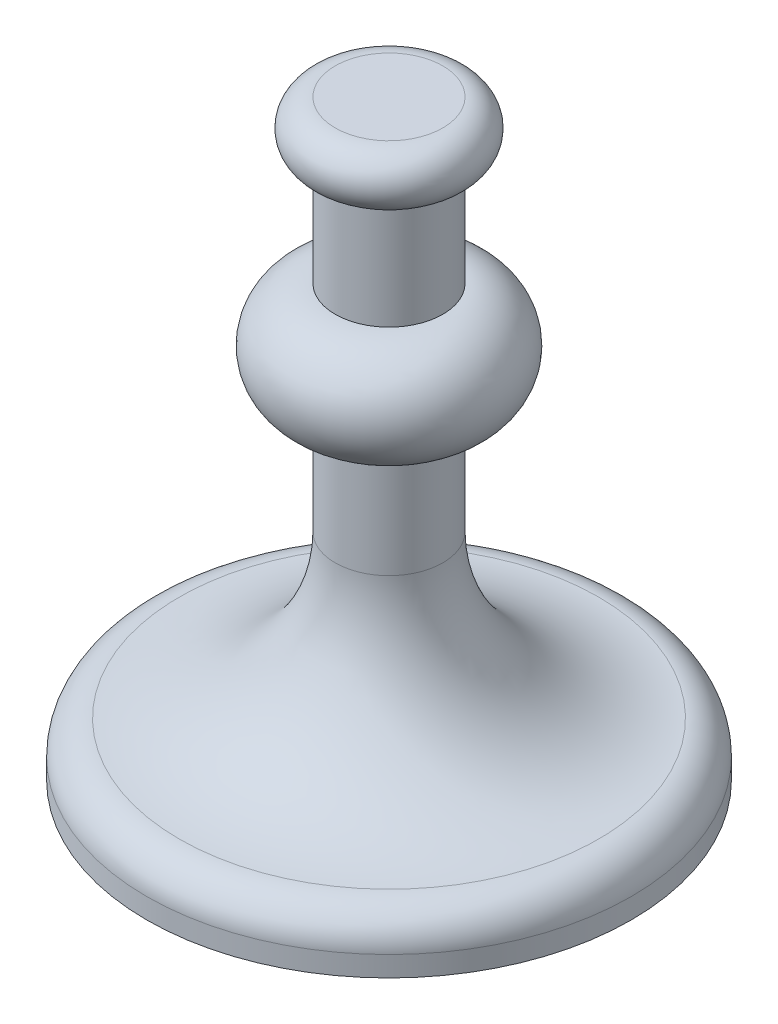
ISO-10303-21;
HEADER;
FILE_DESCRIPTION(('STEP AP214'),'2;1');
FILE_NAME('part.step','',(''),(''),'','','');
FILE_SCHEMA(('AUTOMOTIVE_DESIGN { 1 0 10303 214 1 1 1 1 }'));
ENDSEC;
DATA;
#1=APPLICATION_CONTEXT('core data for automotive mechanical design processes');
#2=APPLICATION_PROTOCOL_DEFINITION('international standard','automotive_design',2000,#1);
#3=PRODUCT_CONTEXT('',#1,'mechanical');
#4=PRODUCT('Part','Part','',(#3));
#5=PRODUCT_RELATED_PRODUCT_CATEGORY('part','',(#4));
#6=PRODUCT_DEFINITION_FORMATION('','',#4);
#7=PRODUCT_DEFINITION_CONTEXT('part definition',#1,'design');
#8=PRODUCT_DEFINITION('design','',#6,#7);
#9=PRODUCT_DEFINITION_SHAPE('','',#8);
#10=(LENGTH_UNIT() NAMED_UNIT(*) SI_UNIT(.MILLI.,.METRE.));
#11=(NAMED_UNIT(*) PLANE_ANGLE_UNIT() SI_UNIT($,.RADIAN.));
#12=(NAMED_UNIT(*) SI_UNIT($,.STERADIAN.) SOLID_ANGLE_UNIT());
#13=UNCERTAINTY_MEASURE_WITH_UNIT(LENGTH_MEASURE(1.E-05),#10,'distance_accuracy_value','');
#14=(GEOMETRIC_REPRESENTATION_CONTEXT(3) GLOBAL_UNCERTAINTY_ASSIGNED_CONTEXT((#13)) GLOBAL_UNIT_ASSIGNED_CONTEXT((#10,
#11,#12)) REPRESENTATION_CONTEXT('',''));
#15=CARTESIAN_POINT('',(0.,0.,0.));
#16=DIRECTION('',(0.,0.,1.));
#17=DIRECTION('',(1.,0.,0.));
#18=AXIS2_PLACEMENT_3D('',#15,#16,#17);
#19=CARTESIAN_POINT('',(0.,100.,0.));
#20=DIRECTION('',(0.,1.,0.));
#21=DIRECTION('',(0.,0.,1.));
#22=AXIS2_PLACEMENT_3D('',#19,#20,#21);
#23=TOROIDAL_SURFACE('',#22,20.,9.99999999999999);
#24=CARTESIAN_POINT('',(0.,110.,0.));
#25=DIRECTION('',(0.,1.,0.));
#26=DIRECTION('',(0.,0.,1.));
#27=AXIS2_PLACEMENT_3D('',#24,#25,#26);
#28=CIRCLE('',#27,20.);
#29=CARTESIAN_POINT('',(0.,110.,20.));
#30=VERTEX_POINT('',#29);
#31=EDGE_CURVE('E78',#30,#30,#28,.T.);
#32=ORIENTED_EDGE('',*,*,#31,.F.);
#33=EDGE_LOOP('',(#32));
#34=FACE_BOUND('',#33,.T.);
#35=CARTESIAN_POINT('',(0.,90.,0.));
#36=DIRECTION('',(0.,1.,0.));
#37=DIRECTION('',(0.,0.,1.));
#38=AXIS2_PLACEMENT_3D('',#35,#36,#37);
#39=CIRCLE('',#38,20.);
#40=CARTESIAN_POINT('',(0.,90.,20.));
#41=VERTEX_POINT('',#40);
#42=EDGE_CURVE('E10',#41,#41,#39,.T.);
#43=ORIENTED_EDGE('',*,*,#42,.T.);
#44=EDGE_LOOP('',(#43));
#45=FACE_BOUND('',#44,.T.);
#46=ADVANCED_FACE('F43',(#34,#45),#23,.T.);
#47=CARTESIAN_POINT('',(0.,110.,0.));
#48=DIRECTION('',(0.,1.,0.));
#49=DIRECTION('',(0.,0.,1.));
#50=AXIS2_PLACEMENT_3D('',#47,#48,#49);
#51=CYLINDRICAL_SURFACE('',#50,20.);
#52=ORIENTED_EDGE('',*,*,#42,.F.);
#53=EDGE_LOOP('',(#52));
#54=FACE_BOUND('',#53,.T.);
#55=CARTESIAN_POINT('',(0.,50.,0.));
#56=DIRECTION('',(0.,1.,0.));
#57=DIRECTION('',(0.,0.,1.));
#58=AXIS2_PLACEMENT_3D('',#55,#56,#57);
#59=CIRCLE('',#58,20.);
#60=CARTESIAN_POINT('',(0.,50.,20.));
#61=VERTEX_POINT('',#60);
#62=EDGE_CURVE('E50',#61,#61,#59,.T.);
#63=ORIENTED_EDGE('',*,*,#62,.T.);
#64=EDGE_LOOP('',(#63));
#65=FACE_BOUND('',#64,.T.);
#66=ADVANCED_FACE('F86',(#54,#65),#51,.T.);
#67=CARTESIAN_POINT('',(0.,30.0008100600805,0.));
#68=DIRECTION('',(0.,1.,0.));
#69=DIRECTION('',(0.,0.,1.));
#70=AXIS2_PLACEMENT_3D('',#67,#68,#69);
#71=TOROIDAL_SURFACE('',#70,20.1800048527752,20.);
#72=ORIENTED_EDGE('',*,*,#62,.F.);
#73=EDGE_LOOP('',(#72));
#74=FACE_BOUND('',#73,.T.);
#75=CARTESIAN_POINT('',(0.,10.001620120161,0.));
#76=DIRECTION('',(0.,1.,0.));
#77=DIRECTION('',(0.,0.,1.));
#78=AXIS2_PLACEMENT_3D('',#75,#76,#77);
#79=CIRCLE('',#78,20.);
#80=CARTESIAN_POINT('',(0.,10.001620120161,20.));
#81=VERTEX_POINT('',#80);
#82=EDGE_CURVE('E55',#81,#81,#79,.T.);
#83=ORIENTED_EDGE('',*,*,#82,.T.);
#84=EDGE_LOOP('',(#83));
#85=FACE_BOUND('',#84,.T.);
#86=ADVANCED_FACE('F90',(#74,#85),#71,.T.);
#87=CARTESIAN_POINT('',(0.,110.,0.));
#88=DIRECTION('',(0.,1.,0.));
#89=DIRECTION('',(0.,0.,1.));
#90=AXIS2_PLACEMENT_3D('',#87,#88,#89);
#91=CYLINDRICAL_SURFACE('',#90,20.);
#92=ORIENTED_EDGE('',*,*,#82,.F.);
#93=EDGE_LOOP('',(#92));
#94=FACE_BOUND('',#93,.T.);
#95=CARTESIAN_POINT('',(0.,-30.,0.));
#96=DIRECTION('',(0.,1.,0.));
#97=DIRECTION('',(0.,0.,1.));
#98=AXIS2_PLACEMENT_3D('',#95,#96,#97);
#99=CIRCLE('',#98,20.);
#100=CARTESIAN_POINT('',(0.,-30.,20.));
#101=VERTEX_POINT('',#100);
#102=EDGE_CURVE('E60',#101,#101,#99,.T.);
#103=ORIENTED_EDGE('',*,*,#102,.T.);
#104=EDGE_LOOP('',(#103));
#105=FACE_BOUND('',#104,.T.);
#106=ADVANCED_FACE('F95',(#94,#105),#91,.T.);
#107=CARTESIAN_POINT('',(0.,-30.,0.));
#108=DIRECTION('',(0.,1.,0.));
#109=DIRECTION('',(0.,0.,1.));
#110=AXIS2_PLACEMENT_3D('',#107,#108,#109);
#111=TOROIDAL_SURFACE('',#110,80.,60.);
#112=ORIENTED_EDGE('',*,*,#102,.F.);
#113=EDGE_LOOP('',(#112));
#114=FACE_BOUND('',#113,.T.);
#115=CARTESIAN_POINT('',(0.,-89.964317570439,0.));
#116=DIRECTION('',(0.,1.,0.));
#117=DIRECTION('',(0.,0.,1.));
#118=AXIS2_PLACEMENT_3D('',#115,#116,#117);
#119=CIRCLE('',#118,77.9310344827586);
#120=CARTESIAN_POINT('',(0.,-89.964317570439,77.9310344827586));
#121=VERTEX_POINT('',#120);
#122=EDGE_CURVE('E66',#121,#121,#119,.T.);
#123=ORIENTED_EDGE('',*,*,#122,.T.);
#124=EDGE_LOOP('',(#123));
#125=FACE_BOUND('',#124,.T.);
#126=ADVANCED_FACE('F101',(#114,#125),#111,.F.);
#127=CARTESIAN_POINT('',(0.,-102.456883730947,0.));
#128=DIRECTION('',(0.,1.,0.));
#129=DIRECTION('',(0.,0.,1.));
#130=AXIS2_PLACEMENT_3D('',#127,#128,#129);
#131=TOROIDAL_SURFACE('',#130,77.5,12.5);
#132=ORIENTED_EDGE('',*,*,#122,.F.);
#133=EDGE_LOOP('',(#132));
#134=FACE_BOUND('',#133,.T.);
#135=CARTESIAN_POINT('',(0.,-102.456883730947,0.));
#136=DIRECTION('',(0.,1.,0.));
#137=DIRECTION('',(0.,0.,1.));
#138=AXIS2_PLACEMENT_3D('',#135,#136,#137);
#139=CIRCLE('',#138,90.);
#140=CARTESIAN_POINT('',(0.,-102.456883730947,90.));
#141=VERTEX_POINT('',#140);
#142=EDGE_CURVE('E70',#141,#141,#139,.T.);
#143=ORIENTED_EDGE('',*,*,#142,.T.);
#144=EDGE_LOOP('',(#143));
#145=FACE_BOUND('',#144,.T.);
#146=ADVANCED_FACE('F105',(#134,#145),#131,.T.);
#147=CARTESIAN_POINT('',(0.,110.,0.));
#148=DIRECTION('',(0.,1.,0.));
#149=DIRECTION('',(0.,0.,1.));
#150=AXIS2_PLACEMENT_3D('',#147,#148,#149);
#151=CYLINDRICAL_SURFACE('',#150,90.);
#152=ORIENTED_EDGE('',*,*,#142,.F.);
#153=EDGE_LOOP('',(#152));
#154=FACE_BOUND('',#153,.T.);
#155=CARTESIAN_POINT('',(0.,-110.,0.));
#156=DIRECTION('',(0.,1.,0.));
#157=DIRECTION('',(0.,0.,1.));
#158=AXIS2_PLACEMENT_3D('',#155,#156,#157);
#159=CIRCLE('',#158,90.);
#160=CARTESIAN_POINT('',(0.,-110.,90.));
#161=VERTEX_POINT('',#160);
#162=EDGE_CURVE('E74',#161,#161,#159,.T.);
#163=ORIENTED_EDGE('',*,*,#162,.T.);
#164=EDGE_LOOP('',(#163));
#165=FACE_BOUND('',#164,.T.);
#166=ADVANCED_FACE('F109',(#154,#165),#151,.T.);
#167=CARTESIAN_POINT('',(0.,-110.,0.));
#168=DIRECTION('',(0.,1.,0.));
#169=DIRECTION('',(0.,0.,1.));
#170=AXIS2_PLACEMENT_3D('',#167,#168,#169);
#171=PLANE('',#170);
#172=ORIENTED_EDGE('',*,*,#162,.F.);
#173=EDGE_LOOP('',(#172));
#174=FACE_BOUND('',#173,.T.);
#175=ADVANCED_FACE('F113',(#174),#171,.F.);
#176=CARTESIAN_POINT('',(0.,110.,0.));
#177=DIRECTION('',(0.,-1.,0.));
#178=DIRECTION('',(0.,0.,-1.));
#179=AXIS2_PLACEMENT_3D('',#176,#177,#178);
#180=PLANE('',#179);
#181=ORIENTED_EDGE('',*,*,#31,.T.);
#182=EDGE_LOOP('',(#181));
#183=FACE_BOUND('',#182,.T.);
#184=ADVANCED_FACE('F83',(#183),#180,.F.);
#185=CLOSED_SHELL('',(#46,#66,#86,#106,#126,#146,#166,#175,#184));
#186=MANIFOLD_SOLID_BREP('B2',#185);
#187=ADVANCED_BREP_SHAPE_REPRESENTATION('',(#18,#186),#14);
#188=SHAPE_DEFINITION_REPRESENTATION(#9,#187);
ENDSEC;
END-ISO-10303-21;
